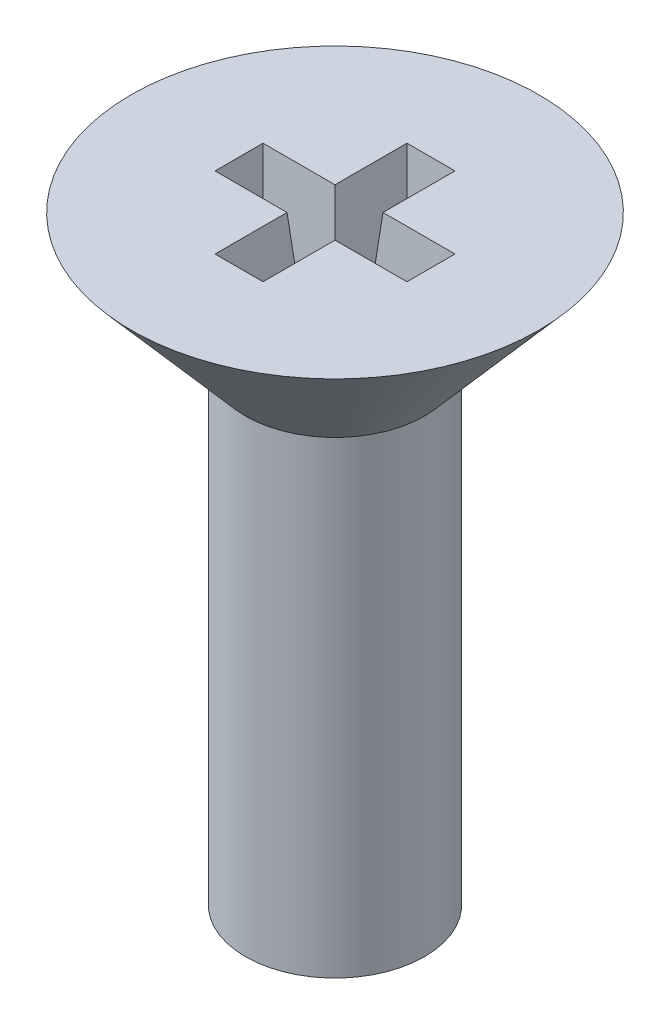
ISO-10303-21;
HEADER;
FILE_DESCRIPTION(('STEP AP214'),'2;1');
FILE_NAME('part.step','',(''),(''),'','','');
FILE_SCHEMA(('AUTOMOTIVE_DESIGN { 1 0 10303 214 1 1 1 1 }'));
ENDSEC;
DATA;
#1=APPLICATION_CONTEXT('core data for automotive mechanical design processes');
#2=APPLICATION_PROTOCOL_DEFINITION('international standard','automotive_design',2000,#1);
#3=PRODUCT_CONTEXT('',#1,'mechanical');
#4=PRODUCT('Part','Part','',(#3));
#5=PRODUCT_RELATED_PRODUCT_CATEGORY('part','',(#4));
#6=PRODUCT_DEFINITION_FORMATION('','',#4);
#7=PRODUCT_DEFINITION_CONTEXT('part definition',#1,'design');
#8=PRODUCT_DEFINITION('design','',#6,#7);
#9=PRODUCT_DEFINITION_SHAPE('','',#8);
#10=(LENGTH_UNIT() NAMED_UNIT(*) SI_UNIT(.MILLI.,.METRE.));
#11=(NAMED_UNIT(*) PLANE_ANGLE_UNIT() SI_UNIT($,.RADIAN.));
#12=(NAMED_UNIT(*) SI_UNIT($,.STERADIAN.) SOLID_ANGLE_UNIT());
#13=UNCERTAINTY_MEASURE_WITH_UNIT(LENGTH_MEASURE(1.E-05),#10,'distance_accuracy_value','');
#14=(GEOMETRIC_REPRESENTATION_CONTEXT(3) GLOBAL_UNCERTAINTY_ASSIGNED_CONTEXT((#13)) GLOBAL_UNIT_ASSIGNED_CONTEXT((#10,
#11,#12)) REPRESENTATION_CONTEXT('',''));
#15=CARTESIAN_POINT('',(0.,0.,0.));
#16=DIRECTION('',(0.,0.,1.));
#17=DIRECTION('',(1.,0.,0.));
#18=AXIS2_PLACEMENT_3D('',#15,#16,#17);
#19=CARTESIAN_POINT('',(0.,-7.4358159356459,0.));
#20=DIRECTION('',(0.,1.,0.));
#21=DIRECTION('',(-1.,0.,0.));
#22=AXIS2_PLACEMENT_3D('',#19,#20,#21);
#23=PLANE('',#22);
#24=CARTESIAN_POINT('',(0.,-7.4358159356459,0.));
#25=DIRECTION('',(0.,1.,0.));
#26=DIRECTION('',(-1.,0.,0.));
#27=AXIS2_PLACEMENT_3D('',#24,#25,#26);
#28=CIRCLE('',#27,1.4224);
#29=CARTESIAN_POINT('',(-1.4224,-7.4358159356459,0.));
#30=VERTEX_POINT('',#29);
#31=EDGE_CURVE('E11',#30,#30,#28,.T.);
#32=ORIENTED_EDGE('',*,*,#31,.F.);
#33=EDGE_LOOP('',(#32));
#34=FACE_BOUND('',#33,.T.);
#35=ADVANCED_FACE('F33',(#34),#23,.F.);
#36=CARTESIAN_POINT('',(0.,0.,0.));
#37=DIRECTION('',(0.,1.,0.));
#38=DIRECTION('',(-1.,0.,0.));
#39=AXIS2_PLACEMENT_3D('',#36,#37,#38);
#40=CYLINDRICAL_SURFACE('',#39,1.4224);
#41=CARTESIAN_POINT('',(0.,0.,0.));
#42=DIRECTION('',(0.,1.,0.));
#43=DIRECTION('',(-1.,0.,0.));
#44=AXIS2_PLACEMENT_3D('',#41,#42,#43);
#45=CIRCLE('',#44,1.4224);
#46=CARTESIAN_POINT('',(-1.4224,0.,0.));
#47=VERTEX_POINT('',#46);
#48=EDGE_CURVE('E40',#47,#47,#45,.T.);
#49=ORIENTED_EDGE('',*,*,#48,.F.);
#50=EDGE_LOOP('',(#49));
#51=FACE_BOUND('',#50,.T.);
#52=ORIENTED_EDGE('',*,*,#31,.T.);
#53=EDGE_LOOP('',(#52));
#54=FACE_BOUND('',#53,.T.);
#55=ADVANCED_FACE('F232',(#51,#54),#40,.T.);
#56=CARTESIAN_POINT('',(0.,0.,0.));
#57=DIRECTION('',(0.,1.,0.));
#58=DIRECTION('',(-1.,0.,0.));
#59=AXIS2_PLACEMENT_3D('',#56,#57,#58);
#60=CONICAL_SURFACE('',#59,1.4224,0.715584993317668);
#61=CARTESIAN_POINT('',(0.,2.0891840643541,0.));
#62=DIRECTION('',(0.,1.,0.));
#63=DIRECTION('',(-1.,0.,0.));
#64=AXIS2_PLACEMENT_3D('',#61,#62,#63);
#65=CIRCLE('',#64,3.23849999999999);
#66=CARTESIAN_POINT('',(-3.23849999999999,2.0891840643541,0.));
#67=VERTEX_POINT('',#66);
#68=EDGE_CURVE('E176',#67,#67,#65,.T.);
#69=ORIENTED_EDGE('',*,*,#68,.F.);
#70=EDGE_LOOP('',(#69));
#71=FACE_BOUND('',#70,.T.);
#72=ORIENTED_EDGE('',*,*,#48,.T.);
#73=EDGE_LOOP('',(#72));
#74=FACE_BOUND('',#73,.T.);
#75=ADVANCED_FACE('F230',(#71,#74),#60,.T.);
#76=CARTESIAN_POINT('',(3.23849999999999,2.0891840643541,0.));
#77=DIRECTION('',(0.,-1.,0.));
#78=DIRECTION('',(1.,0.,0.));
#79=AXIS2_PLACEMENT_3D('',#76,#77,#78);
#80=PLANE('',#79);
#81=DIRECTION('',(-1.,0.,0.));
#82=VECTOR('',#81,1.);
#83=CARTESIAN_POINT('',(-1.524,2.0891840643541,-0.381));
#84=LINE('',#83,#82);
#85=CARTESIAN_POINT('',(-0.381,2.0891840643541,-0.381));
#86=VERTEX_POINT('',#85);
#87=CARTESIAN_POINT('',(-1.524,2.0891840643541,-0.381));
#88=VERTEX_POINT('',#87);
#89=EDGE_CURVE('E139',#86,#88,#84,.T.);
#90=ORIENTED_EDGE('',*,*,#89,.F.);
#91=DIRECTION('',(0.,0.,1.));
#92=VECTOR('',#91,1.);
#93=CARTESIAN_POINT('',(-0.381,2.0891840643541,-0.381));
#94=LINE('',#93,#92);
#95=CARTESIAN_POINT('',(-0.381,2.0891840643541,-1.524));
#96=VERTEX_POINT('',#95);
#97=EDGE_CURVE('E47',#96,#86,#94,.T.);
#98=ORIENTED_EDGE('',*,*,#97,.F.);
#99=DIRECTION('',(-1.,0.,0.));
#100=VECTOR('',#99,1.);
#101=CARTESIAN_POINT('',(-0.381,2.0891840643541,-1.524));
#102=LINE('',#101,#100);
#103=CARTESIAN_POINT('',(0.381,2.0891840643541,-1.524));
#104=VERTEX_POINT('',#103);
#105=EDGE_CURVE('E172',#104,#96,#102,.T.);
#106=ORIENTED_EDGE('',*,*,#105,.F.);
#107=DIRECTION('',(0.,0.,-1.));
#108=VECTOR('',#107,1.);
#109=CARTESIAN_POINT('',(0.381,2.0891840643541,-1.524));
#110=LINE('',#109,#108);
#111=CARTESIAN_POINT('',(0.381,2.0891840643541,-0.381));
#112=VERTEX_POINT('',#111);
#113=EDGE_CURVE('E170',#112,#104,#110,.T.);
#114=ORIENTED_EDGE('',*,*,#113,.F.);
#115=DIRECTION('',(-1.,0.,0.));
#116=VECTOR('',#115,1.);
#117=CARTESIAN_POINT('',(0.381,2.0891840643541,-0.381));
#118=LINE('',#117,#116);
#119=CARTESIAN_POINT('',(1.524,2.0891840643541,-0.381));
#120=VERTEX_POINT('',#119);
#121=EDGE_CURVE('E167',#120,#112,#118,.T.);
#122=ORIENTED_EDGE('',*,*,#121,.F.);
#123=DIRECTION('',(0.,0.,-1.));
#124=VECTOR('',#123,1.);
#125=CARTESIAN_POINT('',(1.524,2.0891840643541,-0.381));
#126=LINE('',#125,#124);
#127=CARTESIAN_POINT('',(1.524,2.0891840643541,0.381));
#128=VERTEX_POINT('',#127);
#129=EDGE_CURVE('E164',#128,#120,#126,.T.);
#130=ORIENTED_EDGE('',*,*,#129,.F.);
#131=DIRECTION('',(1.,0.,0.));
#132=VECTOR('',#131,1.);
#133=CARTESIAN_POINT('',(1.524,2.0891840643541,0.381));
#134=LINE('',#133,#132);
#135=CARTESIAN_POINT('',(0.381,2.0891840643541,0.381));
#136=VERTEX_POINT('',#135);
#137=EDGE_CURVE('E161',#136,#128,#134,.T.);
#138=ORIENTED_EDGE('',*,*,#137,.F.);
#139=DIRECTION('',(0.,0.,-1.));
#140=VECTOR('',#139,1.);
#141=CARTESIAN_POINT('',(0.381,2.0891840643541,0.381));
#142=LINE('',#141,#140);
#143=CARTESIAN_POINT('',(0.381,2.0891840643541,1.524));
#144=VERTEX_POINT('',#143);
#145=EDGE_CURVE('E158',#144,#136,#142,.T.);
#146=ORIENTED_EDGE('',*,*,#145,.F.);
#147=DIRECTION('',(1.,0.,0.));
#148=VECTOR('',#147,1.);
#149=CARTESIAN_POINT('',(0.381,2.0891840643541,1.524));
#150=LINE('',#149,#148);
#151=CARTESIAN_POINT('',(-0.381,2.0891840643541,1.524));
#152=VERTEX_POINT('',#151);
#153=EDGE_CURVE('E155',#152,#144,#150,.T.);
#154=ORIENTED_EDGE('',*,*,#153,.F.);
#155=DIRECTION('',(0.,0.,1.));
#156=VECTOR('',#155,1.);
#157=CARTESIAN_POINT('',(-0.381,2.0891840643541,1.524));
#158=LINE('',#157,#156);
#159=CARTESIAN_POINT('',(-0.381,2.0891840643541,0.381));
#160=VERTEX_POINT('',#159);
#161=EDGE_CURVE('E149',#160,#152,#158,.T.);
#162=ORIENTED_EDGE('',*,*,#161,.F.);
#163=DIRECTION('',(1.,0.,0.));
#164=VECTOR('',#163,1.);
#165=CARTESIAN_POINT('',(-0.381,2.0891840643541,0.381));
#166=LINE('',#165,#164);
#167=CARTESIAN_POINT('',(-1.524,2.0891840643541,0.381));
#168=VERTEX_POINT('',#167);
#169=EDGE_CURVE('E147',#168,#160,#166,.T.);
#170=ORIENTED_EDGE('',*,*,#169,.F.);
#171=DIRECTION('',(0.,0.,1.));
#172=VECTOR('',#171,1.);
#173=CARTESIAN_POINT('',(-1.524,2.0891840643541,0.381));
#174=LINE('',#173,#172);
#175=EDGE_CURVE('E130',#88,#168,#174,.T.);
#176=ORIENTED_EDGE('',*,*,#175,.F.);
#177=EDGE_LOOP('',(#90,#98,#106,#114,#122,#130,#138,#146,#154,#162,#170,#176));
#178=FACE_BOUND('',#177,.T.);
#179=ORIENTED_EDGE('',*,*,#68,.T.);
#180=EDGE_LOOP('',(#179));
#181=FACE_BOUND('',#180,.T.);
#182=ADVANCED_FACE('F143',(#178,#181),#80,.F.);
#183=CARTESIAN_POINT('',(-0.381,2.0891840643541,-0.381));
#184=DIRECTION('',(-0.996194698091746,-0.0871557427476583,0.));
#185=DIRECTION('',(0.0871557427476583,-0.996194698091746,0.));
#186=AXIS2_PLACEMENT_3D('',#183,#184,#185);
#187=PLANE('',#186);
#188=ORIENTED_EDGE('',*,*,#97,.T.);
#189=DIRECTION('',(-0.0868265938642477,0.992432509138967,-0.0868265938642476));
#190=VECTOR('',#189,1.);
#191=CARTESIAN_POINT('',(-0.389616914010563,2.18767584218322,-0.389616914010563));
#192=LINE('',#191,#190);
#193=CARTESIAN_POINT('',(-0.19211197544753,-0.069815935645904,-0.19211197544753));
#194=VERTEX_POINT('',#193);
#195=EDGE_CURVE('E90',#194,#86,#192,.T.);
#196=ORIENTED_EDGE('',*,*,#195,.F.);
#197=DIRECTION('',(0.,0.,1.));
#198=VECTOR('',#197,1.);
#199=CARTESIAN_POINT('',(-0.19211197544753,-0.069815935645904,-0.381));
#200=LINE('',#199,#198);
#201=CARTESIAN_POINT('',(-0.19211197544753,-0.069815935645904,-1.33511197544753));
#202=VERTEX_POINT('',#201);
#203=EDGE_CURVE('E174',#202,#194,#200,.T.);
#204=ORIENTED_EDGE('',*,*,#203,.F.);
#205=DIRECTION('',(-0.0868265938642477,0.992432509138967,-0.0868265938642476));
#206=VECTOR('',#205,1.);
#207=CARTESIAN_POINT('',(-0.381,2.0891840643541,-1.524));
#208=LINE('',#207,#206);
#209=EDGE_CURVE('E55',#202,#96,#208,.T.);
#210=ORIENTED_EDGE('',*,*,#209,.T.);
#211=EDGE_LOOP('',(#188,#196,#204,#210));
#212=FACE_BOUND('',#211,.T.);
#213=ADVANCED_FACE('F257',(#212),#187,.F.);
#214=CARTESIAN_POINT('',(-0.381,2.0891840643541,-1.524));
#215=DIRECTION('',(0.,-0.0871557427476582,-0.996194698091745));
#216=DIRECTION('',(0.,0.996194698091746,-0.0871557427476582));
#217=AXIS2_PLACEMENT_3D('',#214,#215,#216);
#218=PLANE('',#217);
#219=ORIENTED_EDGE('',*,*,#105,.T.);
#220=ORIENTED_EDGE('',*,*,#209,.F.);
#221=DIRECTION('',(-1.,0.,0.));
#222=VECTOR('',#221,1.);
#223=CARTESIAN_POINT('',(-0.381,-0.069815935645904,-1.33511197544753));
#224=LINE('',#223,#222);
#225=CARTESIAN_POINT('',(0.19211197544753,-0.069815935645904,-1.33511197544753));
#226=VERTEX_POINT('',#225);
#227=EDGE_CURVE('E177',#226,#202,#224,.T.);
#228=ORIENTED_EDGE('',*,*,#227,.F.);
#229=DIRECTION('',(0.0868265938642475,0.992432509138967,-0.0868265938642476));
#230=VECTOR('',#229,1.);
#231=CARTESIAN_POINT('',(0.381,2.0891840643541,-1.524));
#232=LINE('',#231,#230);
#233=EDGE_CURVE('E95',#226,#104,#232,.T.);
#234=ORIENTED_EDGE('',*,*,#233,.T.);
#235=EDGE_LOOP('',(#219,#220,#228,#234));
#236=FACE_BOUND('',#235,.T.);
#237=ADVANCED_FACE('F264',(#236),#218,.F.);
#238=CARTESIAN_POINT('',(0.381,2.0891840643541,-1.524));
#239=DIRECTION('',(0.996194698091746,-0.0871557427476581,0.));
#240=DIRECTION('',(0.0871557427476581,0.996194698091746,0.));
#241=AXIS2_PLACEMENT_3D('',#238,#239,#240);
#242=PLANE('',#241);
#243=ORIENTED_EDGE('',*,*,#113,.T.);
#244=ORIENTED_EDGE('',*,*,#233,.F.);
#245=DIRECTION('',(0.,0.,-1.));
#246=VECTOR('',#245,1.);
#247=CARTESIAN_POINT('',(0.19211197544753,-0.069815935645904,-1.524));
#248=LINE('',#247,#246);
#249=CARTESIAN_POINT('',(0.192111975447531,-0.069815935645904,-0.19211197544753));
#250=VERTEX_POINT('',#249);
#251=EDGE_CURVE('E200',#250,#226,#248,.T.);
#252=ORIENTED_EDGE('',*,*,#251,.F.);
#253=DIRECTION('',(0.0868265938642475,0.992432509138967,-0.0868265938642476));
#254=VECTOR('',#253,1.);
#255=CARTESIAN_POINT('',(0.389616914010563,2.18767584218322,-0.389616914010563));
#256=LINE('',#255,#254);
#257=EDGE_CURVE('E192',#250,#112,#256,.T.);
#258=ORIENTED_EDGE('',*,*,#257,.T.);
#259=EDGE_LOOP('',(#243,#244,#252,#258));
#260=FACE_BOUND('',#259,.T.);
#261=ADVANCED_FACE('F271',(#260),#242,.F.);
#262=CARTESIAN_POINT('',(0.381,2.0891840643541,-0.381));
#263=DIRECTION('',(0.,-0.0871557427476582,-0.996194698091746));
#264=DIRECTION('',(0.,0.996194698091746,-0.0871557427476582));
#265=AXIS2_PLACEMENT_3D('',#262,#263,#264);
#266=PLANE('',#265);
#267=ORIENTED_EDGE('',*,*,#121,.T.);
#268=ORIENTED_EDGE('',*,*,#257,.F.);
#269=DIRECTION('',(-1.,0.,0.));
#270=VECTOR('',#269,1.);
#271=CARTESIAN_POINT('',(0.381,-0.069815935645904,-0.19211197544753));
#272=LINE('',#271,#270);
#273=CARTESIAN_POINT('',(1.33511197544753,-0.069815935645904,-0.19211197544753));
#274=VERTEX_POINT('',#273);
#275=EDGE_CURVE('E203',#274,#250,#272,.T.);
#276=ORIENTED_EDGE('',*,*,#275,.F.);
#277=DIRECTION('',(0.0868265938642476,0.992432509138967,-0.0868265938642476));
#278=VECTOR('',#277,1.);
#279=CARTESIAN_POINT('',(1.524,2.0891840643541,-0.381));
#280=LINE('',#279,#278);
#281=EDGE_CURVE('E190',#274,#120,#280,.T.);
#282=ORIENTED_EDGE('',*,*,#281,.T.);
#283=EDGE_LOOP('',(#267,#268,#276,#282));
#284=FACE_BOUND('',#283,.T.);
#285=ADVANCED_FACE('F278',(#284),#266,.F.);
#286=CARTESIAN_POINT('',(1.524,2.0891840643541,-0.381));
#287=DIRECTION('',(0.996194698091745,-0.0871557427476581,0.));
#288=DIRECTION('',(0.0871557427476581,0.996194698091746,0.));
#289=AXIS2_PLACEMENT_3D('',#286,#287,#288);
#290=PLANE('',#289);
#291=ORIENTED_EDGE('',*,*,#129,.T.);
#292=ORIENTED_EDGE('',*,*,#281,.F.);
#293=DIRECTION('',(0.,0.,-1.));
#294=VECTOR('',#293,1.);
#295=CARTESIAN_POINT('',(1.33511197544753,-0.069815935645904,-0.381));
#296=LINE('',#295,#294);
#297=CARTESIAN_POINT('',(1.33511197544753,-0.069815935645904,0.19211197544753));
#298=VERTEX_POINT('',#297);
#299=EDGE_CURVE('E206',#298,#274,#296,.T.);
#300=ORIENTED_EDGE('',*,*,#299,.F.);
#301=DIRECTION('',(0.0868265938642476,0.992432509138967,0.0868265938642476));
#302=VECTOR('',#301,1.);
#303=CARTESIAN_POINT('',(1.524,2.0891840643541,0.381));
#304=LINE('',#303,#302);
#305=EDGE_CURVE('E188',#298,#128,#304,.T.);
#306=ORIENTED_EDGE('',*,*,#305,.T.);
#307=EDGE_LOOP('',(#291,#292,#300,#306));
#308=FACE_BOUND('',#307,.T.);
#309=ADVANCED_FACE('F286',(#308),#290,.F.);
#310=CARTESIAN_POINT('',(1.524,2.0891840643541,0.381));
#311=DIRECTION('',(0.,-0.0871557427476582,0.996194698091746));
#312=DIRECTION('',(0.,-0.996194698091746,-0.0871557427476582));
#313=AXIS2_PLACEMENT_3D('',#310,#311,#312);
#314=PLANE('',#313);
#315=ORIENTED_EDGE('',*,*,#137,.T.);
#316=ORIENTED_EDGE('',*,*,#305,.F.);
#317=DIRECTION('',(1.,0.,0.));
#318=VECTOR('',#317,1.);
#319=CARTESIAN_POINT('',(1.524,-0.069815935645904,0.19211197544753));
#320=LINE('',#319,#318);
#321=CARTESIAN_POINT('',(0.19211197544753,-0.069815935645904,0.19211197544753));
#322=VERTEX_POINT('',#321);
#323=EDGE_CURVE('E209',#322,#298,#320,.T.);
#324=ORIENTED_EDGE('',*,*,#323,.F.);
#325=DIRECTION('',(0.0868265938642475,0.992432509138967,0.0868265938642476));
#326=VECTOR('',#325,1.);
#327=CARTESIAN_POINT('',(0.389616914010563,2.18767584218322,0.389616914010563));
#328=LINE('',#327,#326);
#329=EDGE_CURVE('E186',#322,#136,#328,.T.);
#330=ORIENTED_EDGE('',*,*,#329,.T.);
#331=EDGE_LOOP('',(#315,#316,#324,#330));
#332=FACE_BOUND('',#331,.T.);
#333=ADVANCED_FACE('F294',(#332),#314,.F.);
#334=CARTESIAN_POINT('',(0.381,2.0891840643541,0.381));
#335=DIRECTION('',(0.996194698091746,-0.0871557427476581,0.));
#336=DIRECTION('',(0.0871557427476581,0.996194698091746,0.));
#337=AXIS2_PLACEMENT_3D('',#334,#335,#336);
#338=PLANE('',#337);
#339=ORIENTED_EDGE('',*,*,#145,.T.);
#340=ORIENTED_EDGE('',*,*,#329,.F.);
#341=DIRECTION('',(0.,0.,-1.));
#342=VECTOR('',#341,1.);
#343=CARTESIAN_POINT('',(0.19211197544753,-0.069815935645904,0.381));
#344=LINE('',#343,#342);
#345=CARTESIAN_POINT('',(0.19211197544753,-0.069815935645904,1.33511197544753));
#346=VERTEX_POINT('',#345);
#347=EDGE_CURVE('E212',#346,#322,#344,.T.);
#348=ORIENTED_EDGE('',*,*,#347,.F.);
#349=DIRECTION('',(0.0868265938642475,0.992432509138967,0.0868265938642476));
#350=VECTOR('',#349,1.);
#351=CARTESIAN_POINT('',(0.381,2.0891840643541,1.524));
#352=LINE('',#351,#350);
#353=EDGE_CURVE('E184',#346,#144,#352,.T.);
#354=ORIENTED_EDGE('',*,*,#353,.T.);
#355=EDGE_LOOP('',(#339,#340,#348,#354));
#356=FACE_BOUND('',#355,.T.);
#357=ADVANCED_FACE('F302',(#356),#338,.F.);
#358=CARTESIAN_POINT('',(0.381,2.0891840643541,1.524));
#359=DIRECTION('',(0.,-0.0871557427476582,0.996194698091745));
#360=DIRECTION('',(0.,-0.996194698091746,-0.0871557427476582));
#361=AXIS2_PLACEMENT_3D('',#358,#359,#360);
#362=PLANE('',#361);
#363=ORIENTED_EDGE('',*,*,#153,.T.);
#364=ORIENTED_EDGE('',*,*,#353,.F.);
#365=DIRECTION('',(1.,0.,0.));
#366=VECTOR('',#365,1.);
#367=CARTESIAN_POINT('',(0.381,-0.069815935645904,1.33511197544753));
#368=LINE('',#367,#366);
#369=CARTESIAN_POINT('',(-0.19211197544753,-0.069815935645904,1.33511197544753));
#370=VERTEX_POINT('',#369);
#371=EDGE_CURVE('E215',#370,#346,#368,.T.);
#372=ORIENTED_EDGE('',*,*,#371,.F.);
#373=DIRECTION('',(-0.0868265938642477,0.992432509138967,0.0868265938642476));
#374=VECTOR('',#373,1.);
#375=CARTESIAN_POINT('',(-0.381,2.0891840643541,1.524));
#376=LINE('',#375,#374);
#377=EDGE_CURVE('E182',#370,#152,#376,.T.);
#378=ORIENTED_EDGE('',*,*,#377,.T.);
#379=EDGE_LOOP('',(#363,#364,#372,#378));
#380=FACE_BOUND('',#379,.T.);
#381=ADVANCED_FACE('F310',(#380),#362,.F.);
#382=CARTESIAN_POINT('',(-0.381,2.0891840643541,1.524));
#383=DIRECTION('',(-0.996194698091746,-0.0871557427476583,0.));
#384=DIRECTION('',(0.0871557427476583,-0.996194698091746,0.));
#385=AXIS2_PLACEMENT_3D('',#382,#383,#384);
#386=PLANE('',#385);
#387=ORIENTED_EDGE('',*,*,#161,.T.);
#388=ORIENTED_EDGE('',*,*,#377,.F.);
#389=DIRECTION('',(0.,0.,1.));
#390=VECTOR('',#389,1.);
#391=CARTESIAN_POINT('',(-0.19211197544753,-0.069815935645904,1.524));
#392=LINE('',#391,#390);
#393=CARTESIAN_POINT('',(-0.19211197544753,-0.069815935645904,0.19211197544753));
#394=VERTEX_POINT('',#393);
#395=EDGE_CURVE('E218',#394,#370,#392,.T.);
#396=ORIENTED_EDGE('',*,*,#395,.F.);
#397=DIRECTION('',(-0.0868265938642477,0.992432509138967,0.0868265938642476));
#398=VECTOR('',#397,1.);
#399=CARTESIAN_POINT('',(-0.389616914010563,2.18767584218322,0.389616914010563));
#400=LINE('',#399,#398);
#401=EDGE_CURVE('E180',#394,#160,#400,.T.);
#402=ORIENTED_EDGE('',*,*,#401,.T.);
#403=EDGE_LOOP('',(#387,#388,#396,#402));
#404=FACE_BOUND('',#403,.T.);
#405=ADVANCED_FACE('F318',(#404),#386,.F.);
#406=CARTESIAN_POINT('',(-0.381,2.0891840643541,0.381));
#407=DIRECTION('',(0.,-0.0871557427476582,0.996194698091746));
#408=DIRECTION('',(0.,-0.996194698091746,-0.0871557427476582));
#409=AXIS2_PLACEMENT_3D('',#406,#407,#408);
#410=PLANE('',#409);
#411=ORIENTED_EDGE('',*,*,#169,.T.);
#412=ORIENTED_EDGE('',*,*,#401,.F.);
#413=DIRECTION('',(1.,0.,0.));
#414=VECTOR('',#413,1.);
#415=CARTESIAN_POINT('',(-0.381,-0.069815935645904,0.19211197544753));
#416=LINE('',#415,#414);
#417=CARTESIAN_POINT('',(-1.33511197544753,-0.069815935645904,0.19211197544753));
#418=VERTEX_POINT('',#417);
#419=EDGE_CURVE('E221',#418,#394,#416,.T.);
#420=ORIENTED_EDGE('',*,*,#419,.F.);
#421=DIRECTION('',(-0.0868265938642477,0.992432509138967,0.0868265938642476));
#422=VECTOR('',#421,1.);
#423=CARTESIAN_POINT('',(-1.524,2.0891840643541,0.381));
#424=LINE('',#423,#422);
#425=EDGE_CURVE('E136',#418,#168,#424,.T.);
#426=ORIENTED_EDGE('',*,*,#425,.T.);
#427=EDGE_LOOP('',(#411,#412,#420,#426));
#428=FACE_BOUND('',#427,.T.);
#429=ADVANCED_FACE('F326',(#428),#410,.F.);
#430=CARTESIAN_POINT('',(-1.524,2.0891840643541,0.381));
#431=DIRECTION('',(-0.996194698091745,-0.0871557427476583,0.));
#432=DIRECTION('',(0.0871557427476583,-0.996194698091746,0.));
#433=AXIS2_PLACEMENT_3D('',#430,#431,#432);
#434=PLANE('',#433);
#435=ORIENTED_EDGE('',*,*,#175,.T.);
#436=ORIENTED_EDGE('',*,*,#425,.F.);
#437=DIRECTION('',(0.,0.,1.));
#438=VECTOR('',#437,1.);
#439=CARTESIAN_POINT('',(-1.33511197544753,-0.069815935645904,0.381));
#440=LINE('',#439,#438);
#441=CARTESIAN_POINT('',(-1.33511197544753,-0.069815935645904,-0.19211197544753));
#442=VERTEX_POINT('',#441);
#443=EDGE_CURVE('E133',#442,#418,#440,.T.);
#444=ORIENTED_EDGE('',*,*,#443,.F.);
#445=DIRECTION('',(-0.0868265938642477,0.992432509138967,-0.0868265938642476));
#446=VECTOR('',#445,1.);
#447=CARTESIAN_POINT('',(-1.524,2.0891840643541,-0.381));
#448=LINE('',#447,#446);
#449=EDGE_CURVE('E126',#442,#88,#448,.T.);
#450=ORIENTED_EDGE('',*,*,#449,.T.);
#451=EDGE_LOOP('',(#435,#436,#444,#450));
#452=FACE_BOUND('',#451,.T.);
#453=ADVANCED_FACE('F128',(#452),#434,.F.);
#454=CARTESIAN_POINT('',(-1.524,2.0891840643541,-0.381));
#455=DIRECTION('',(0.,-0.0871557427476582,-0.996194698091746));
#456=DIRECTION('',(0.,0.996194698091746,-0.0871557427476582));
#457=AXIS2_PLACEMENT_3D('',#454,#455,#456);
#458=PLANE('',#457);
#459=ORIENTED_EDGE('',*,*,#89,.T.);
#460=ORIENTED_EDGE('',*,*,#449,.F.);
#461=DIRECTION('',(-1.,0.,0.));
#462=VECTOR('',#461,1.);
#463=CARTESIAN_POINT('',(-1.524,-0.069815935645904,-0.19211197544753));
#464=LINE('',#463,#462);
#465=EDGE_CURVE('E197',#194,#442,#464,.T.);
#466=ORIENTED_EDGE('',*,*,#465,.F.);
#467=ORIENTED_EDGE('',*,*,#195,.T.);
#468=EDGE_LOOP('',(#459,#460,#466,#467));
#469=FACE_BOUND('',#468,.T.);
#470=ADVANCED_FACE('F140',(#469),#458,.F.);
#471=CARTESIAN_POINT('',(0.,-0.069815935645904,0.));
#472=DIRECTION('',(0.,-1.,0.));
#473=DIRECTION('',(0.,0.,-1.));
#474=AXIS2_PLACEMENT_3D('',#471,#472,#473);
#475=PLANE('',#474);
#476=ORIENTED_EDGE('',*,*,#203,.T.);
#477=ORIENTED_EDGE('',*,*,#465,.T.);
#478=ORIENTED_EDGE('',*,*,#443,.T.);
#479=ORIENTED_EDGE('',*,*,#419,.T.);
#480=ORIENTED_EDGE('',*,*,#395,.T.);
#481=ORIENTED_EDGE('',*,*,#371,.T.);
#482=ORIENTED_EDGE('',*,*,#347,.T.);
#483=ORIENTED_EDGE('',*,*,#323,.T.);
#484=ORIENTED_EDGE('',*,*,#299,.T.);
#485=ORIENTED_EDGE('',*,*,#275,.T.);
#486=ORIENTED_EDGE('',*,*,#251,.T.);
#487=ORIENTED_EDGE('',*,*,#227,.T.);
#488=EDGE_LOOP('',(#476,#477,#478,#479,#480,#481,#482,#483,#484,#485,#486,#487));
#489=FACE_BOUND('',#488,.T.);
#490=ADVANCED_FACE('F347',(#489),#475,.F.);
#491=CLOSED_SHELL('',(#35,#55,#75,#182,#213,#237,#261,#285,#309,#333,#357,#381,#405,#429,#453,
#470,#490));
#492=MANIFOLD_SOLID_BREP('B2',#491);
#493=ADVANCED_BREP_SHAPE_REPRESENTATION('',(#18,#492),#14);
#494=SHAPE_DEFINITION_REPRESENTATION(#9,#493);
ENDSEC;
END-ISO-10303-21;
